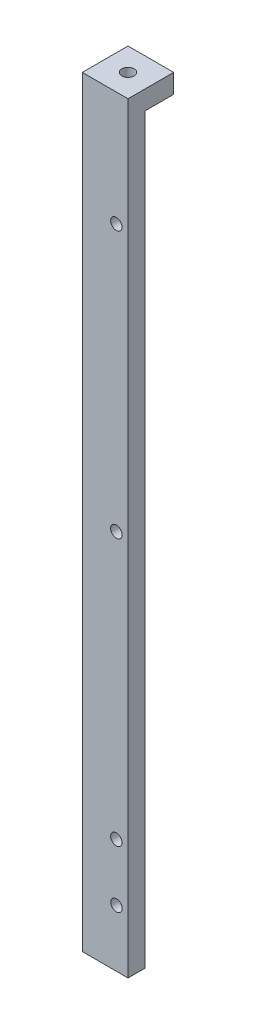
ISO-10303-21;
HEADER;
FILE_DESCRIPTION(('STEP AP214'),'2;1');
FILE_NAME('part.step','',(''),(''),'','','');
FILE_SCHEMA(('AUTOMOTIVE_DESIGN { 1 0 10303 214 1 1 1 1 }'));
ENDSEC;
DATA;
#1=APPLICATION_CONTEXT('core data for automotive mechanical design processes');
#2=APPLICATION_PROTOCOL_DEFINITION('international standard','automotive_design',2000,#1);
#3=PRODUCT_CONTEXT('',#1,'mechanical');
#4=PRODUCT('Part','Part','',(#3));
#5=PRODUCT_RELATED_PRODUCT_CATEGORY('part','',(#4));
#6=PRODUCT_DEFINITION_FORMATION('','',#4);
#7=PRODUCT_DEFINITION_CONTEXT('part definition',#1,'design');
#8=PRODUCT_DEFINITION('design','',#6,#7);
#9=PRODUCT_DEFINITION_SHAPE('','',#8);
#10=(LENGTH_UNIT() NAMED_UNIT(*) SI_UNIT(.MILLI.,.METRE.));
#11=(NAMED_UNIT(*) PLANE_ANGLE_UNIT() SI_UNIT($,.RADIAN.));
#12=(NAMED_UNIT(*) SI_UNIT($,.STERADIAN.) SOLID_ANGLE_UNIT());
#13=UNCERTAINTY_MEASURE_WITH_UNIT(LENGTH_MEASURE(1.E-05),#10,'distance_accuracy_value','');
#14=(GEOMETRIC_REPRESENTATION_CONTEXT(3) GLOBAL_UNCERTAINTY_ASSIGNED_CONTEXT((#13)) GLOBAL_UNIT_ASSIGNED_CONTEXT((#10,
#11,#12)) REPRESENTATION_CONTEXT('',''));
#15=CARTESIAN_POINT('',(0.,0.,0.));
#16=DIRECTION('',(0.,0.,1.));
#17=DIRECTION('',(1.,0.,0.));
#18=AXIS2_PLACEMENT_3D('',#15,#16,#17);
#19=CARTESIAN_POINT('',(0.,200.,0.));
#20=DIRECTION('',(0.,-1.,0.));
#21=DIRECTION('',(0.,0.,-1.));
#22=AXIS2_PLACEMENT_3D('',#19,#20,#21);
#23=CYLINDRICAL_SURFACE('',#22,1.5);
#24=CARTESIAN_POINT('',(0.,182.,0.));
#25=DIRECTION('',(0.,1.,0.));
#26=DIRECTION('',(0.,0.,1.));
#27=AXIS2_PLACEMENT_3D('',#24,#25,#26);
#28=CIRCLE('',#27,1.5);
#29=CARTESIAN_POINT('',(0.,182.,1.5));
#30=VERTEX_POINT('',#29);
#31=CARTESIAN_POINT('',(-1.5,182.,0.));
#32=VERTEX_POINT('',#31);
#33=EDGE_CURVE('E127',#30,#32,#28,.F.);
#34=ORIENTED_EDGE('',*,*,#33,.F.);
#35=DIRECTION('',(0.,-1.,0.));
#36=VECTOR('',#35,1.);
#37=CARTESIAN_POINT('',(0.,200.,1.5));
#38=LINE('',#37,#36);
#39=CARTESIAN_POINT('',(0.,0.,1.5));
#40=VERTEX_POINT('',#39);
#41=EDGE_CURVE('E140',#30,#40,#38,.T.);
#42=ORIENTED_EDGE('',*,*,#41,.T.);
#43=CARTESIAN_POINT('',(0.,0.,0.));
#44=DIRECTION('',(0.,-1.,0.));
#45=DIRECTION('',(0.,0.,1.));
#46=AXIS2_PLACEMENT_3D('',#43,#44,#45);
#47=CIRCLE('',#46,1.5);
#48=CARTESIAN_POINT('',(-1.5,0.,0.));
#49=VERTEX_POINT('',#48);
#50=EDGE_CURVE('E170',#40,#49,#47,.T.);
#51=ORIENTED_EDGE('',*,*,#50,.T.);
#52=DIRECTION('',(0.,-1.,0.));
#53=VECTOR('',#52,1.);
#54=CARTESIAN_POINT('',(-1.5,200.,0.));
#55=LINE('',#54,#53);
#56=EDGE_CURVE('E190',#32,#49,#55,.T.);
#57=ORIENTED_EDGE('',*,*,#56,.F.);
#58=EDGE_LOOP('',(#34,#42,#51,#57));
#59=FACE_BOUND('',#58,.T.);
#60=ADVANCED_FACE('F34',(#59),#23,.F.);
#61=CARTESIAN_POINT('',(0.,200.,1.5));
#62=DIRECTION('',(0.,0.,1.));
#63=DIRECTION('',(1.,0.,0.));
#64=AXIS2_PLACEMENT_3D('',#61,#62,#63);
#65=PLANE('',#64);
#66=CARTESIAN_POINT('',(2.96687441302363,15.,1.5));
#67=DIRECTION('',(0.,0.,-1.));
#68=DIRECTION('',(-1.,0.,0.));
#69=AXIS2_PLACEMENT_3D('',#66,#67,#68);
#70=CIRCLE('',#69,1.5);
#71=CARTESIAN_POINT('',(1.46687441302363,15.,1.5));
#72=VERTEX_POINT('',#71);
#73=EDGE_CURVE('E222',#72,#72,#70,.T.);
#74=ORIENTED_EDGE('',*,*,#73,.F.);
#75=EDGE_LOOP('',(#74));
#76=FACE_BOUND('',#75,.T.);
#77=CARTESIAN_POINT('',(2.93374882604773,170.,1.5));
#78=DIRECTION('',(0.,0.,-1.));
#79=DIRECTION('',(-1.,0.,0.));
#80=AXIS2_PLACEMENT_3D('',#77,#78,#79);
#81=CIRCLE('',#80,1.5);
#82=CARTESIAN_POINT('',(1.43374882604773,170.,1.5));
#83=VERTEX_POINT('',#82);
#84=EDGE_CURVE('E226',#83,#83,#81,.T.);
#85=ORIENTED_EDGE('',*,*,#84,.F.);
#86=EDGE_LOOP('',(#85));
#87=FACE_BOUND('',#86,.T.);
#88=CARTESIAN_POINT('',(2.93374882604749,100.,1.5));
#89=DIRECTION('',(0.,0.,-1.));
#90=DIRECTION('',(-1.,0.,0.));
#91=AXIS2_PLACEMENT_3D('',#88,#89,#90);
#92=CIRCLE('',#91,1.5);
#93=CARTESIAN_POINT('',(1.43374882604749,100.,1.5));
#94=VERTEX_POINT('',#93);
#95=EDGE_CURVE('E231',#94,#94,#92,.T.);
#96=ORIENTED_EDGE('',*,*,#95,.F.);
#97=EDGE_LOOP('',(#96));
#98=FACE_BOUND('',#97,.T.);
#99=CARTESIAN_POINT('',(2.93374882604725,30.,1.5));
#100=DIRECTION('',(0.,0.,-1.));
#101=DIRECTION('',(-1.,0.,0.));
#102=AXIS2_PLACEMENT_3D('',#99,#100,#101);
#103=CIRCLE('',#102,1.5);
#104=CARTESIAN_POINT('',(1.43374882604725,30.,1.5));
#105=VERTEX_POINT('',#104);
#106=EDGE_CURVE('E202',#105,#105,#103,.T.);
#107=ORIENTED_EDGE('',*,*,#106,.F.);
#108=EDGE_LOOP('',(#107));
#109=FACE_BOUND('',#108,.T.);
#110=DIRECTION('',(-1.,0.,0.));
#111=VECTOR('',#110,1.);
#112=CARTESIAN_POINT('',(0.,182.,1.5));
#113=LINE('',#112,#111);
#114=CARTESIAN_POINT('',(2.59807621135332,182.,1.5));
#115=VERTEX_POINT('',#114);
#116=EDGE_CURVE('E131',#115,#30,#113,.T.);
#117=ORIENTED_EDGE('',*,*,#116,.F.);
#118=DIRECTION('',(0.,1.,0.));
#119=VECTOR('',#118,1.);
#120=CARTESIAN_POINT('',(2.59807621135332,182.,1.5));
#121=LINE('',#120,#119);
#122=CARTESIAN_POINT('',(2.59807621135332,195.,1.5));
#123=VERTEX_POINT('',#122);
#124=EDGE_CURVE('E119',#115,#123,#121,.T.);
#125=ORIENTED_EDGE('',*,*,#124,.T.);
#126=DIRECTION('',(-1.,0.,0.));
#127=VECTOR('',#126,1.);
#128=CARTESIAN_POINT('',(0.,195.,1.5));
#129=LINE('',#128,#127);
#130=CARTESIAN_POINT('',(6.,195.,1.5));
#131=VERTEX_POINT('',#130);
#132=EDGE_CURVE('E157',#131,#123,#129,.T.);
#133=ORIENTED_EDGE('',*,*,#132,.F.);
#134=DIRECTION('',(0.,-1.,0.));
#135=VECTOR('',#134,1.);
#136=CARTESIAN_POINT('',(6.,200.,1.5));
#137=LINE('',#136,#135);
#138=CARTESIAN_POINT('',(6.,0.,1.5));
#139=VERTEX_POINT('',#138);
#140=EDGE_CURVE('E193',#131,#139,#137,.T.);
#141=ORIENTED_EDGE('',*,*,#140,.T.);
#142=DIRECTION('',(-1.,0.,0.));
#143=VECTOR('',#142,1.);
#144=CARTESIAN_POINT('',(0.,0.,1.5));
#145=LINE('',#144,#143);
#146=EDGE_CURVE('E168',#139,#40,#145,.T.);
#147=ORIENTED_EDGE('',*,*,#146,.T.);
#148=ORIENTED_EDGE('',*,*,#41,.F.);
#149=EDGE_LOOP('',(#117,#125,#133,#141,#147,#148));
#150=FACE_BOUND('',#149,.T.);
#151=ADVANCED_FACE('F138',(#76,#87,#98,#109,#150),#65,.F.);
#152=CARTESIAN_POINT('',(-1.5,200.,0.));
#153=DIRECTION('',(-1.,0.,0.));
#154=DIRECTION('',(0.,0.,1.));
#155=AXIS2_PLACEMENT_3D('',#152,#153,#154);
#156=PLANE('',#155);
#157=CARTESIAN_POINT('',(-1.5,170.,-2.93816557097695));
#158=DIRECTION('',(1.,0.,0.));
#159=DIRECTION('',(0.,0.,-1.));
#160=AXIS2_PLACEMENT_3D('',#157,#158,#159);
#161=CIRCLE('',#160,1.5);
#162=CARTESIAN_POINT('',(-1.5,170.,-4.43816557097695));
#163=VERTEX_POINT('',#162);
#164=EDGE_CURVE('E429',#163,#163,#161,.T.);
#165=ORIENTED_EDGE('',*,*,#164,.F.);
#166=EDGE_LOOP('',(#165));
#167=FACE_BOUND('',#166,.T.);
#168=CARTESIAN_POINT('',(-1.5,100.,-2.93816557097719));
#169=DIRECTION('',(1.,0.,0.));
#170=DIRECTION('',(0.,0.,-1.));
#171=AXIS2_PLACEMENT_3D('',#168,#169,#170);
#172=CIRCLE('',#171,1.5);
#173=CARTESIAN_POINT('',(-1.5,100.,-4.43816557097719));
#174=VERTEX_POINT('',#173);
#175=EDGE_CURVE('E430',#174,#174,#172,.T.);
#176=ORIENTED_EDGE('',*,*,#175,.F.);
#177=EDGE_LOOP('',(#176));
#178=FACE_BOUND('',#177,.T.);
#179=CARTESIAN_POINT('',(-1.5,15.,-2.96687441302361));
#180=DIRECTION('',(1.,0.,0.));
#181=DIRECTION('',(0.,0.,-1.));
#182=AXIS2_PLACEMENT_3D('',#179,#180,#181);
#183=CIRCLE('',#182,1.5);
#184=CARTESIAN_POINT('',(-1.5,15.,-4.46687441302361));
#185=VERTEX_POINT('',#184);
#186=EDGE_CURVE('E433',#185,#185,#183,.T.);
#187=ORIENTED_EDGE('',*,*,#186,.F.);
#188=EDGE_LOOP('',(#187));
#189=FACE_BOUND('',#188,.T.);
#190=CARTESIAN_POINT('',(-1.5,30.,-2.93816557097743));
#191=DIRECTION('',(1.,0.,0.));
#192=DIRECTION('',(0.,0.,-1.));
#193=AXIS2_PLACEMENT_3D('',#190,#191,#192);
#194=CIRCLE('',#193,1.5);
#195=CARTESIAN_POINT('',(-1.5,30.,-4.43816557097743));
#196=VERTEX_POINT('',#195);
#197=EDGE_CURVE('E215',#196,#196,#194,.T.);
#198=ORIENTED_EDGE('',*,*,#197,.F.);
#199=EDGE_LOOP('',(#198));
#200=FACE_BOUND('',#199,.T.);
#201=DIRECTION('',(0.,0.,-1.));
#202=VECTOR('',#201,1.);
#203=CARTESIAN_POINT('',(-1.5,195.,0.));
#204=LINE('',#203,#202);
#205=CARTESIAN_POINT('',(-1.5,195.,-2.59807621135332));
#206=VERTEX_POINT('',#205);
#207=CARTESIAN_POINT('',(-1.5,195.,-6.));
#208=VERTEX_POINT('',#207);
#209=EDGE_CURVE('E155',#206,#208,#204,.T.);
#210=ORIENTED_EDGE('',*,*,#209,.F.);
#211=DIRECTION('',(0.,1.,0.));
#212=VECTOR('',#211,1.);
#213=CARTESIAN_POINT('',(-1.5,182.,-2.59807621135332));
#214=LINE('',#213,#212);
#215=CARTESIAN_POINT('',(-1.5,182.,-2.59807621135332));
#216=VERTEX_POINT('',#215);
#217=EDGE_CURVE('E51',#206,#216,#214,.F.);
#218=ORIENTED_EDGE('',*,*,#217,.T.);
#219=DIRECTION('',(0.,0.,-1.));
#220=VECTOR('',#219,1.);
#221=CARTESIAN_POINT('',(-1.5,182.,0.));
#222=LINE('',#221,#220);
#223=EDGE_CURVE('E11',#32,#216,#222,.T.);
#224=ORIENTED_EDGE('',*,*,#223,.F.);
#225=ORIENTED_EDGE('',*,*,#56,.T.);
#226=DIRECTION('',(0.,0.,-1.));
#227=VECTOR('',#226,1.);
#228=CARTESIAN_POINT('',(-1.5,0.,0.));
#229=LINE('',#228,#227);
#230=CARTESIAN_POINT('',(-1.5,0.,-6.));
#231=VERTEX_POINT('',#230);
#232=EDGE_CURVE('E173',#49,#231,#229,.T.);
#233=ORIENTED_EDGE('',*,*,#232,.T.);
#234=DIRECTION('',(0.,-1.,0.));
#235=VECTOR('',#234,1.);
#236=CARTESIAN_POINT('',(-1.5,200.,-6.));
#237=LINE('',#236,#235);
#238=EDGE_CURVE('E188',#208,#231,#237,.T.);
#239=ORIENTED_EDGE('',*,*,#238,.F.);
#240=EDGE_LOOP('',(#210,#218,#224,#225,#233,#239));
#241=FACE_BOUND('',#240,.T.);
#242=ADVANCED_FACE('F241',(#167,#178,#189,#200,#241),#156,.F.);
#243=CARTESIAN_POINT('',(6.,200.,1.5));
#244=DIRECTION('',(-1.,0.,0.));
#245=DIRECTION('',(0.,0.,1.));
#246=AXIS2_PLACEMENT_3D('',#243,#244,#245);
#247=PLANE('',#246);
#248=DIRECTION('',(0.,-1.,0.));
#249=VECTOR('',#248,1.);
#250=CARTESIAN_POINT('',(6.,200.,6.));
#251=LINE('',#250,#249);
#252=CARTESIAN_POINT('',(6.,200.,6.));
#253=VERTEX_POINT('',#252);
#254=CARTESIAN_POINT('',(6.,0.,6.));
#255=VERTEX_POINT('',#254);
#256=EDGE_CURVE('E89',#253,#255,#251,.T.);
#257=ORIENTED_EDGE('',*,*,#256,.T.);
#258=DIRECTION('',(0.,0.,-1.));
#259=VECTOR('',#258,1.);
#260=CARTESIAN_POINT('',(6.,0.,1.5));
#261=LINE('',#260,#259);
#262=EDGE_CURVE('E159',#255,#139,#261,.T.);
#263=ORIENTED_EDGE('',*,*,#262,.T.);
#264=ORIENTED_EDGE('',*,*,#140,.F.);
#265=DIRECTION('',(0.,0.,-1.));
#266=VECTOR('',#265,1.);
#267=CARTESIAN_POINT('',(6.,195.,-6.));
#268=LINE('',#267,#266);
#269=CARTESIAN_POINT('',(6.,195.,-6.));
#270=VERTEX_POINT('',#269);
#271=EDGE_CURVE('E144',#131,#270,#268,.T.);
#272=ORIENTED_EDGE('',*,*,#271,.T.);
#273=DIRECTION('',(0.,1.,0.));
#274=VECTOR('',#273,1.);
#275=CARTESIAN_POINT('',(6.,195.,-6.));
#276=LINE('',#275,#274);
#277=CARTESIAN_POINT('',(6.,200.,-6.));
#278=VERTEX_POINT('',#277);
#279=EDGE_CURVE('E152',#270,#278,#276,.T.);
#280=ORIENTED_EDGE('',*,*,#279,.T.);
#281=DIRECTION('',(0.,0.,-1.));
#282=VECTOR('',#281,1.);
#283=CARTESIAN_POINT('',(6.,200.,1.5));
#284=LINE('',#283,#282);
#285=EDGE_CURVE('E160',#253,#278,#284,.T.);
#286=ORIENTED_EDGE('',*,*,#285,.F.);
#287=EDGE_LOOP('',(#257,#263,#264,#272,#280,#286));
#288=FACE_BOUND('',#287,.T.);
#289=ADVANCED_FACE('F36',(#288),#247,.F.);
#290=CARTESIAN_POINT('',(-6.,200.,-6.));
#291=DIRECTION('',(0.,0.,1.));
#292=DIRECTION('',(1.,0.,0.));
#293=AXIS2_PLACEMENT_3D('',#290,#291,#292);
#294=PLANE('',#293);
#295=DIRECTION('',(-1.,0.,0.));
#296=VECTOR('',#295,1.);
#297=CARTESIAN_POINT('',(-6.,200.,-6.));
#298=LINE('',#297,#296);
#299=CARTESIAN_POINT('',(-6.,200.,-6.));
#300=VERTEX_POINT('',#299);
#301=EDGE_CURVE('E93',#278,#300,#298,.T.);
#302=ORIENTED_EDGE('',*,*,#301,.F.);
#303=ORIENTED_EDGE('',*,*,#279,.F.);
#304=DIRECTION('',(-1.,0.,0.));
#305=VECTOR('',#304,1.);
#306=CARTESIAN_POINT('',(-6.,195.,-6.));
#307=LINE('',#306,#305);
#308=EDGE_CURVE('E149',#270,#208,#307,.T.);
#309=ORIENTED_EDGE('',*,*,#308,.T.);
#310=ORIENTED_EDGE('',*,*,#238,.T.);
#311=DIRECTION('',(-1.,0.,0.));
#312=VECTOR('',#311,1.);
#313=CARTESIAN_POINT('',(-6.,0.,-6.));
#314=LINE('',#313,#312);
#315=CARTESIAN_POINT('',(-6.,0.,-6.));
#316=VERTEX_POINT('',#315);
#317=EDGE_CURVE('E176',#231,#316,#314,.T.);
#318=ORIENTED_EDGE('',*,*,#317,.T.);
#319=DIRECTION('',(0.,-1.,0.));
#320=VECTOR('',#319,1.);
#321=CARTESIAN_POINT('',(-6.,200.,-6.));
#322=LINE('',#321,#320);
#323=EDGE_CURVE('E186',#300,#316,#322,.T.);
#324=ORIENTED_EDGE('',*,*,#323,.F.);
#325=EDGE_LOOP('',(#302,#303,#309,#310,#318,#324));
#326=FACE_BOUND('',#325,.T.);
#327=ADVANCED_FACE('F249',(#326),#294,.F.);
#328=CARTESIAN_POINT('',(-6.,200.,-6.));
#329=DIRECTION('',(1.,0.,0.));
#330=DIRECTION('',(0.,0.,-1.));
#331=AXIS2_PLACEMENT_3D('',#328,#329,#330);
#332=PLANE('',#331);
#333=CARTESIAN_POINT('',(-6.,170.,-2.93816557097695));
#334=DIRECTION('',(1.,0.,0.));
#335=DIRECTION('',(0.,0.,-1.));
#336=AXIS2_PLACEMENT_3D('',#333,#334,#335);
#337=CIRCLE('',#336,1.5);
#338=CARTESIAN_POINT('',(-6.,170.,-4.43816557097695));
#339=VERTEX_POINT('',#338);
#340=EDGE_CURVE('E38',#339,#339,#337,.T.);
#341=ORIENTED_EDGE('',*,*,#340,.T.);
#342=EDGE_LOOP('',(#341));
#343=FACE_BOUND('',#342,.T.);
#344=CARTESIAN_POINT('',(-6.,100.,-2.93816557097719));
#345=DIRECTION('',(1.,0.,0.));
#346=DIRECTION('',(0.,0.,-1.));
#347=AXIS2_PLACEMENT_3D('',#344,#345,#346);
#348=CIRCLE('',#347,1.5);
#349=CARTESIAN_POINT('',(-6.,100.,-4.43816557097719));
#350=VERTEX_POINT('',#349);
#351=EDGE_CURVE('E217',#350,#350,#348,.T.);
#352=ORIENTED_EDGE('',*,*,#351,.T.);
#353=EDGE_LOOP('',(#352));
#354=FACE_BOUND('',#353,.T.);
#355=CARTESIAN_POINT('',(-6.,15.,-2.96687441302361));
#356=DIRECTION('',(1.,0.,0.));
#357=DIRECTION('',(0.,0.,-1.));
#358=AXIS2_PLACEMENT_3D('',#355,#356,#357);
#359=CIRCLE('',#358,1.5);
#360=CARTESIAN_POINT('',(-6.,15.,-4.46687441302361));
#361=VERTEX_POINT('',#360);
#362=EDGE_CURVE('E214',#361,#361,#359,.T.);
#363=ORIENTED_EDGE('',*,*,#362,.T.);
#364=EDGE_LOOP('',(#363));
#365=FACE_BOUND('',#364,.T.);
#366=CARTESIAN_POINT('',(-6.,30.,-2.93816557097743));
#367=DIRECTION('',(1.,0.,0.));
#368=DIRECTION('',(0.,0.,-1.));
#369=AXIS2_PLACEMENT_3D('',#366,#367,#368);
#370=CIRCLE('',#369,1.5);
#371=CARTESIAN_POINT('',(-6.,30.,-4.43816557097743));
#372=VERTEX_POINT('',#371);
#373=EDGE_CURVE('E211',#372,#372,#370,.T.);
#374=ORIENTED_EDGE('',*,*,#373,.T.);
#375=EDGE_LOOP('',(#374));
#376=FACE_BOUND('',#375,.T.);
#377=ORIENTED_EDGE('',*,*,#323,.T.);
#378=DIRECTION('',(0.,0.,1.));
#379=VECTOR('',#378,1.);
#380=CARTESIAN_POINT('',(-6.,0.,-6.));
#381=LINE('',#380,#379);
#382=CARTESIAN_POINT('',(-6.,0.,6.));
#383=VERTEX_POINT('',#382);
#384=EDGE_CURVE('E179',#316,#383,#381,.T.);
#385=ORIENTED_EDGE('',*,*,#384,.T.);
#386=DIRECTION('',(0.,-1.,0.));
#387=VECTOR('',#386,1.);
#388=CARTESIAN_POINT('',(-6.,200.,6.));
#389=LINE('',#388,#387);
#390=CARTESIAN_POINT('',(-6.,200.,6.));
#391=VERTEX_POINT('',#390);
#392=EDGE_CURVE('E184',#391,#383,#389,.T.);
#393=ORIENTED_EDGE('',*,*,#392,.F.);
#394=DIRECTION('',(0.,0.,1.));
#395=VECTOR('',#394,1.);
#396=CARTESIAN_POINT('',(-6.,200.,-6.));
#397=LINE('',#396,#395);
#398=EDGE_CURVE('E164',#300,#391,#397,.T.);
#399=ORIENTED_EDGE('',*,*,#398,.F.);
#400=EDGE_LOOP('',(#377,#385,#393,#399));
#401=FACE_BOUND('',#400,.T.);
#402=ADVANCED_FACE('F264',(#343,#354,#365,#376,#401),#332,.F.);
#403=CARTESIAN_POINT('',(-6.,200.,6.));
#404=DIRECTION('',(0.,0.,-1.));
#405=DIRECTION('',(-1.,0.,0.));
#406=AXIS2_PLACEMENT_3D('',#403,#404,#405);
#407=PLANE('',#406);
#408=CARTESIAN_POINT('',(2.96687441302363,15.,6.));
#409=DIRECTION('',(0.,0.,-1.));
#410=DIRECTION('',(-1.,0.,0.));
#411=AXIS2_PLACEMENT_3D('',#408,#409,#410);
#412=CIRCLE('',#411,1.5);
#413=CARTESIAN_POINT('',(1.46687441302363,15.,6.));
#414=VERTEX_POINT('',#413);
#415=EDGE_CURVE('E208',#414,#414,#412,.T.);
#416=ORIENTED_EDGE('',*,*,#415,.T.);
#417=EDGE_LOOP('',(#416));
#418=FACE_BOUND('',#417,.T.);
#419=CARTESIAN_POINT('',(2.93374882604773,170.,6.));
#420=DIRECTION('',(0.,0.,-1.));
#421=DIRECTION('',(-1.,0.,0.));
#422=AXIS2_PLACEMENT_3D('',#419,#420,#421);
#423=CIRCLE('',#422,1.5);
#424=CARTESIAN_POINT('',(1.43374882604773,170.,6.));
#425=VERTEX_POINT('',#424);
#426=EDGE_CURVE('E205',#425,#425,#423,.T.);
#427=ORIENTED_EDGE('',*,*,#426,.T.);
#428=EDGE_LOOP('',(#427));
#429=FACE_BOUND('',#428,.T.);
#430=CARTESIAN_POINT('',(2.93374882604749,100.,6.));
#431=DIRECTION('',(0.,0.,-1.));
#432=DIRECTION('',(-1.,0.,0.));
#433=AXIS2_PLACEMENT_3D('',#430,#431,#432);
#434=CIRCLE('',#433,1.5);
#435=CARTESIAN_POINT('',(1.43374882604749,100.,6.));
#436=VERTEX_POINT('',#435);
#437=EDGE_CURVE('E201',#436,#436,#434,.T.);
#438=ORIENTED_EDGE('',*,*,#437,.T.);
#439=EDGE_LOOP('',(#438));
#440=FACE_BOUND('',#439,.T.);
#441=CARTESIAN_POINT('',(2.93374882604725,30.,6.));
#442=DIRECTION('',(0.,0.,-1.));
#443=DIRECTION('',(-1.,0.,0.));
#444=AXIS2_PLACEMENT_3D('',#441,#442,#443);
#445=CIRCLE('',#444,1.5);
#446=CARTESIAN_POINT('',(1.43374882604725,30.,6.));
#447=VERTEX_POINT('',#446);
#448=EDGE_CURVE('E198',#447,#447,#445,.T.);
#449=ORIENTED_EDGE('',*,*,#448,.T.);
#450=EDGE_LOOP('',(#449));
#451=FACE_BOUND('',#450,.T.);
#452=ORIENTED_EDGE('',*,*,#392,.T.);
#453=DIRECTION('',(1.,0.,0.));
#454=VECTOR('',#453,1.);
#455=CARTESIAN_POINT('',(-6.,0.,6.));
#456=LINE('',#455,#454);
#457=EDGE_CURVE('E162',#383,#255,#456,.T.);
#458=ORIENTED_EDGE('',*,*,#457,.T.);
#459=ORIENTED_EDGE('',*,*,#256,.F.);
#460=DIRECTION('',(1.,0.,0.));
#461=VECTOR('',#460,1.);
#462=CARTESIAN_POINT('',(-6.,200.,6.));
#463=LINE('',#462,#461);
#464=EDGE_CURVE('E60',#391,#253,#463,.T.);
#465=ORIENTED_EDGE('',*,*,#464,.F.);
#466=EDGE_LOOP('',(#452,#458,#459,#465));
#467=FACE_BOUND('',#466,.T.);
#468=ADVANCED_FACE('F267',(#418,#429,#440,#451,#467),#407,.F.);
#469=CARTESIAN_POINT('',(0.,200.,0.));
#470=DIRECTION('',(0.,1.,0.));
#471=DIRECTION('',(0.,0.,1.));
#472=AXIS2_PLACEMENT_3D('',#469,#470,#471);
#473=PLANE('',#472);
#474=CARTESIAN_POINT('',(0.,200.,0.));
#475=DIRECTION('',(0.,1.,0.));
#476=DIRECTION('',(0.,0.,1.));
#477=AXIS2_PLACEMENT_3D('',#474,#475,#476);
#478=CIRCLE('',#477,1.625);
#479=CARTESIAN_POINT('',(0.,200.,1.625));
#480=VERTEX_POINT('',#479);
#481=EDGE_CURVE('E141',#480,#480,#478,.T.);
#482=ORIENTED_EDGE('',*,*,#481,.F.);
#483=EDGE_LOOP('',(#482));
#484=FACE_BOUND('',#483,.T.);
#485=ORIENTED_EDGE('',*,*,#285,.T.);
#486=ORIENTED_EDGE('',*,*,#301,.T.);
#487=ORIENTED_EDGE('',*,*,#398,.T.);
#488=ORIENTED_EDGE('',*,*,#464,.T.);
#489=EDGE_LOOP('',(#485,#486,#487,#488));
#490=FACE_BOUND('',#489,.T.);
#491=ADVANCED_FACE('F265',(#484,#490),#473,.T.);
#492=CARTESIAN_POINT('',(0.,0.,0.));
#493=DIRECTION('',(0.,1.,0.));
#494=DIRECTION('',(0.,0.,1.));
#495=AXIS2_PLACEMENT_3D('',#492,#493,#494);
#496=PLANE('',#495);
#497=ORIENTED_EDGE('',*,*,#262,.F.);
#498=ORIENTED_EDGE('',*,*,#457,.F.);
#499=ORIENTED_EDGE('',*,*,#384,.F.);
#500=ORIENTED_EDGE('',*,*,#317,.F.);
#501=ORIENTED_EDGE('',*,*,#232,.F.);
#502=ORIENTED_EDGE('',*,*,#50,.F.);
#503=ORIENTED_EDGE('',*,*,#146,.F.);
#504=EDGE_LOOP('',(#497,#498,#499,#500,#501,#502,#503));
#505=FACE_BOUND('',#504,.T.);
#506=ADVANCED_FACE('F255',(#505),#496,.F.);
#507=CARTESIAN_POINT('',(0.,195.,0.));
#508=DIRECTION('',(0.,1.,0.));
#509=DIRECTION('',(0.,0.,1.));
#510=AXIS2_PLACEMENT_3D('',#507,#508,#509);
#511=PLANE('',#510);
#512=ORIENTED_EDGE('',*,*,#132,.T.);
#513=CARTESIAN_POINT('',(0.,195.,0.));
#514=DIRECTION('',(0.,1.,0.));
#515=DIRECTION('',(0.,0.,1.));
#516=AXIS2_PLACEMENT_3D('',#513,#514,#515);
#517=CIRCLE('',#516,3.);
#518=EDGE_CURVE('E43',#123,#206,#517,.T.);
#519=ORIENTED_EDGE('',*,*,#518,.T.);
#520=ORIENTED_EDGE('',*,*,#209,.T.);
#521=ORIENTED_EDGE('',*,*,#308,.F.);
#522=ORIENTED_EDGE('',*,*,#271,.F.);
#523=EDGE_LOOP('',(#512,#519,#520,#521,#522));
#524=FACE_BOUND('',#523,.T.);
#525=ADVANCED_FACE('F246',(#524),#511,.F.);
#526=CARTESIAN_POINT('',(0.,185.,0.));
#527=DIRECTION('',(0.,1.,0.));
#528=DIRECTION('',(0.,0.,1.));
#529=AXIS2_PLACEMENT_3D('',#526,#527,#528);
#530=CYLINDRICAL_SURFACE('',#529,1.625);
#531=CARTESIAN_POINT('',(0.,197.,0.));
#532=DIRECTION('',(0.,1.,0.));
#533=DIRECTION('',(0.,0.,1.));
#534=AXIS2_PLACEMENT_3D('',#531,#532,#533);
#535=CIRCLE('',#534,1.625);
#536=CARTESIAN_POINT('',(0.,197.,1.625));
#537=VERTEX_POINT('',#536);
#538=EDGE_CURVE('E134',#537,#537,#535,.F.);
#539=ORIENTED_EDGE('',*,*,#538,.T.);
#540=EDGE_LOOP('',(#539));
#541=FACE_BOUND('',#540,.T.);
#542=ORIENTED_EDGE('',*,*,#481,.T.);
#543=EDGE_LOOP('',(#542));
#544=FACE_BOUND('',#543,.T.);
#545=ADVANCED_FACE('F333',(#541,#544),#530,.F.);
#546=CARTESIAN_POINT('',(0.,182.,0.));
#547=DIRECTION('',(0.,1.,0.));
#548=DIRECTION('',(0.,0.,1.));
#549=AXIS2_PLACEMENT_3D('',#546,#547,#548);
#550=PLANE('',#549);
#551=ORIENTED_EDGE('',*,*,#116,.T.);
#552=ORIENTED_EDGE('',*,*,#33,.T.);
#553=ORIENTED_EDGE('',*,*,#223,.T.);
#554=CARTESIAN_POINT('',(0.,182.,0.));
#555=DIRECTION('',(0.,1.,0.));
#556=DIRECTION('',(0.,0.,1.));
#557=AXIS2_PLACEMENT_3D('',#554,#555,#556);
#558=CIRCLE('',#557,3.);
#559=EDGE_CURVE('E122',#216,#115,#558,.T.);
#560=ORIENTED_EDGE('',*,*,#559,.T.);
#561=EDGE_LOOP('',(#551,#552,#553,#560));
#562=FACE_BOUND('',#561,.T.);
#563=ADVANCED_FACE('F130',(#562),#550,.T.);
#564=CARTESIAN_POINT('',(0.,182.,0.));
#565=DIRECTION('',(0.,1.,0.));
#566=DIRECTION('',(0.,0.,1.));
#567=AXIS2_PLACEMENT_3D('',#564,#565,#566);
#568=CYLINDRICAL_SURFACE('',#567,3.);
#569=CARTESIAN_POINT('',(0.,197.,0.));
#570=DIRECTION('',(0.,1.,0.));
#571=DIRECTION('',(0.,0.,1.));
#572=AXIS2_PLACEMENT_3D('',#569,#570,#571);
#573=CIRCLE('',#572,3.);
#574=CARTESIAN_POINT('',(0.,197.,3.));
#575=VERTEX_POINT('',#574);
#576=EDGE_CURVE('E135',#575,#575,#573,.T.);
#577=ORIENTED_EDGE('',*,*,#576,.T.);
#578=EDGE_LOOP('',(#577));
#579=FACE_BOUND('',#578,.T.);
#580=ORIENTED_EDGE('',*,*,#559,.F.);
#581=ORIENTED_EDGE('',*,*,#217,.F.);
#582=ORIENTED_EDGE('',*,*,#518,.F.);
#583=ORIENTED_EDGE('',*,*,#124,.F.);
#584=EDGE_LOOP('',(#580,#581,#582,#583));
#585=FACE_BOUND('',#584,.T.);
#586=ADVANCED_FACE('F121',(#579,#585),#568,.F.);
#587=CARTESIAN_POINT('',(0.,197.,0.));
#588=DIRECTION('',(0.,1.,0.));
#589=DIRECTION('',(0.,0.,1.));
#590=AXIS2_PLACEMENT_3D('',#587,#588,#589);
#591=PLANE('',#590);
#592=ORIENTED_EDGE('',*,*,#576,.F.);
#593=EDGE_LOOP('',(#592));
#594=FACE_BOUND('',#593,.T.);
#595=ORIENTED_EDGE('',*,*,#538,.F.);
#596=EDGE_LOOP('',(#595));
#597=FACE_BOUND('',#596,.T.);
#598=ADVANCED_FACE('F329',(#594,#597),#591,.F.);
#599=CARTESIAN_POINT('',(2.93374882604725,30.,9.5));
#600=DIRECTION('',(0.,0.,-1.));
#601=DIRECTION('',(-1.,0.,0.));
#602=AXIS2_PLACEMENT_3D('',#599,#600,#601);
#603=CYLINDRICAL_SURFACE('',#602,1.5);
#604=ORIENTED_EDGE('',*,*,#106,.T.);
#605=EDGE_LOOP('',(#604));
#606=FACE_BOUND('',#605,.T.);
#607=ORIENTED_EDGE('',*,*,#448,.F.);
#608=EDGE_LOOP('',(#607));
#609=FACE_BOUND('',#608,.T.);
#610=ADVANCED_FACE('F322',(#606,#609),#603,.F.);
#611=CARTESIAN_POINT('',(2.93374882604749,100.,9.5));
#612=DIRECTION('',(0.,0.,-1.));
#613=DIRECTION('',(-1.,0.,0.));
#614=AXIS2_PLACEMENT_3D('',#611,#612,#613);
#615=CYLINDRICAL_SURFACE('',#614,1.5);
#616=ORIENTED_EDGE('',*,*,#95,.T.);
#617=EDGE_LOOP('',(#616));
#618=FACE_BOUND('',#617,.T.);
#619=ORIENTED_EDGE('',*,*,#437,.F.);
#620=EDGE_LOOP('',(#619));
#621=FACE_BOUND('',#620,.T.);
#622=ADVANCED_FACE('F319',(#618,#621),#615,.F.);
#623=CARTESIAN_POINT('',(2.93374882604773,170.,9.5));
#624=DIRECTION('',(0.,0.,-1.));
#625=DIRECTION('',(-1.,0.,0.));
#626=AXIS2_PLACEMENT_3D('',#623,#624,#625);
#627=CYLINDRICAL_SURFACE('',#626,1.5);
#628=ORIENTED_EDGE('',*,*,#84,.T.);
#629=EDGE_LOOP('',(#628));
#630=FACE_BOUND('',#629,.T.);
#631=ORIENTED_EDGE('',*,*,#426,.F.);
#632=EDGE_LOOP('',(#631));
#633=FACE_BOUND('',#632,.T.);
#634=ADVANCED_FACE('F312',(#630,#633),#627,.F.);
#635=CARTESIAN_POINT('',(2.96687441302363,15.,9.5));
#636=DIRECTION('',(0.,0.,-1.));
#637=DIRECTION('',(-1.,0.,0.));
#638=AXIS2_PLACEMENT_3D('',#635,#636,#637);
#639=CYLINDRICAL_SURFACE('',#638,1.5);
#640=ORIENTED_EDGE('',*,*,#73,.T.);
#641=EDGE_LOOP('',(#640));
#642=FACE_BOUND('',#641,.T.);
#643=ORIENTED_EDGE('',*,*,#415,.F.);
#644=EDGE_LOOP('',(#643));
#645=FACE_BOUND('',#644,.T.);
#646=ADVANCED_FACE('F302',(#642,#645),#639,.F.);
#647=CARTESIAN_POINT('',(-9.5,30.,-2.93816557097743));
#648=DIRECTION('',(1.,0.,0.));
#649=DIRECTION('',(0.,0.,-1.));
#650=AXIS2_PLACEMENT_3D('',#647,#648,#649);
#651=CYLINDRICAL_SURFACE('',#650,1.5);
#652=ORIENTED_EDGE('',*,*,#197,.T.);
#653=EDGE_LOOP('',(#652));
#654=FACE_BOUND('',#653,.T.);
#655=ORIENTED_EDGE('',*,*,#373,.F.);
#656=EDGE_LOOP('',(#655));
#657=FACE_BOUND('',#656,.T.);
#658=ADVANCED_FACE('F299',(#654,#657),#651,.F.);
#659=CARTESIAN_POINT('',(-9.5,15.,-2.96687441302361));
#660=DIRECTION('',(1.,0.,0.));
#661=DIRECTION('',(0.,0.,-1.));
#662=AXIS2_PLACEMENT_3D('',#659,#660,#661);
#663=CYLINDRICAL_SURFACE('',#662,1.5);
#664=ORIENTED_EDGE('',*,*,#186,.T.);
#665=EDGE_LOOP('',(#664));
#666=FACE_BOUND('',#665,.T.);
#667=ORIENTED_EDGE('',*,*,#362,.F.);
#668=EDGE_LOOP('',(#667));
#669=FACE_BOUND('',#668,.T.);
#670=ADVANCED_FACE('F301',(#666,#669),#663,.F.);
#671=CARTESIAN_POINT('',(-9.5,100.,-2.93816557097719));
#672=DIRECTION('',(1.,0.,0.));
#673=DIRECTION('',(0.,0.,-1.));
#674=AXIS2_PLACEMENT_3D('',#671,#672,#673);
#675=CYLINDRICAL_SURFACE('',#674,1.5);
#676=ORIENTED_EDGE('',*,*,#175,.T.);
#677=EDGE_LOOP('',(#676));
#678=FACE_BOUND('',#677,.T.);
#679=ORIENTED_EDGE('',*,*,#351,.F.);
#680=EDGE_LOOP('',(#679));
#681=FACE_BOUND('',#680,.T.);
#682=ADVANCED_FACE('F309',(#678,#681),#675,.F.);
#683=CARTESIAN_POINT('',(-9.5,170.,-2.93816557097695));
#684=DIRECTION('',(1.,0.,0.));
#685=DIRECTION('',(0.,0.,-1.));
#686=AXIS2_PLACEMENT_3D('',#683,#684,#685);
#687=CYLINDRICAL_SURFACE('',#686,1.5);
#688=ORIENTED_EDGE('',*,*,#164,.T.);
#689=EDGE_LOOP('',(#688));
#690=FACE_BOUND('',#689,.T.);
#691=ORIENTED_EDGE('',*,*,#340,.F.);
#692=EDGE_LOOP('',(#691));
#693=FACE_BOUND('',#692,.T.);
#694=ADVANCED_FACE('F317',(#690,#693),#687,.F.);
#695=CLOSED_SHELL('',(#60,#151,#242,#289,#327,#402,#468,#491,#506,#525,#545,#563,#586,#598,#610,
#622,#634,#646,#658,#670,#682,#694));
#696=MANIFOLD_SOLID_BREP('B2',#695);
#697=ADVANCED_BREP_SHAPE_REPRESENTATION('',(#18,#696),#14);
#698=SHAPE_DEFINITION_REPRESENTATION(#9,#697);
ENDSEC;
END-ISO-10303-21;
